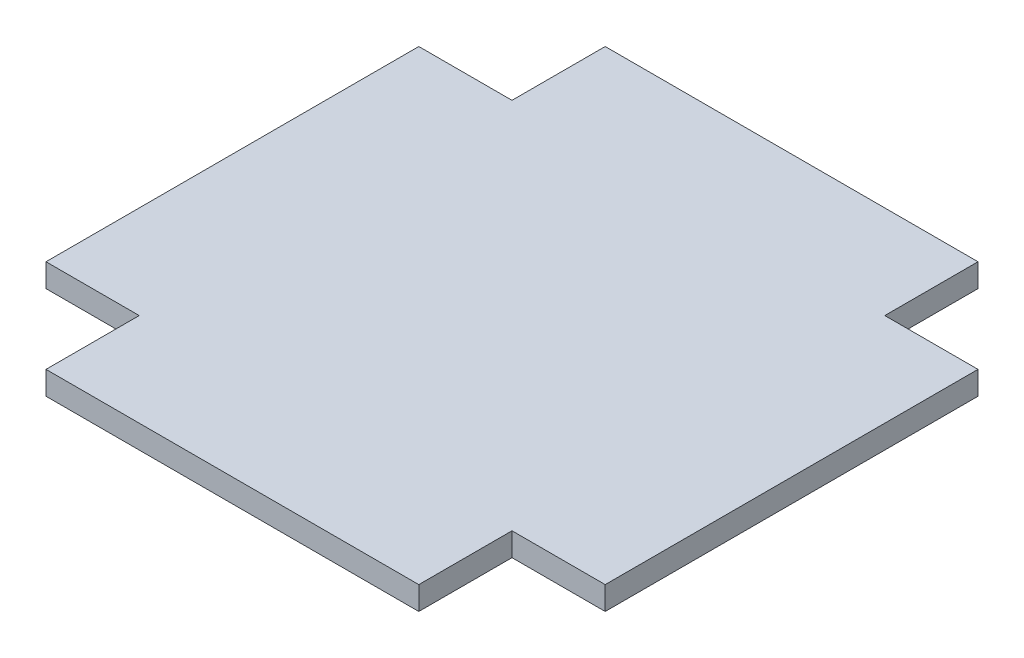
ISO-10303-21;
HEADER;
FILE_DESCRIPTION(('STEP AP214'),'2;1');
FILE_NAME('part.step','',(''),(''),'','','');
FILE_SCHEMA(('AUTOMOTIVE_DESIGN { 1 0 10303 214 1 1 1 1 }'));
ENDSEC;
DATA;
#1=APPLICATION_CONTEXT('core data for automotive mechanical design processes');
#2=APPLICATION_PROTOCOL_DEFINITION('international standard','automotive_design',2000,#1);
#3=PRODUCT_CONTEXT('',#1,'mechanical');
#4=PRODUCT('Part','Part','',(#3));
#5=PRODUCT_RELATED_PRODUCT_CATEGORY('part','',(#4));
#6=PRODUCT_DEFINITION_FORMATION('','',#4);
#7=PRODUCT_DEFINITION_CONTEXT('part definition',#1,'design');
#8=PRODUCT_DEFINITION('design','',#6,#7);
#9=PRODUCT_DEFINITION_SHAPE('','',#8);
#10=(LENGTH_UNIT() NAMED_UNIT(*) SI_UNIT(.MILLI.,.METRE.));
#11=(NAMED_UNIT(*) PLANE_ANGLE_UNIT() SI_UNIT($,.RADIAN.));
#12=(NAMED_UNIT(*) SI_UNIT($,.STERADIAN.) SOLID_ANGLE_UNIT());
#13=UNCERTAINTY_MEASURE_WITH_UNIT(LENGTH_MEASURE(1.E-05),#10,'distance_accuracy_value','');
#14=(GEOMETRIC_REPRESENTATION_CONTEXT(3) GLOBAL_UNCERTAINTY_ASSIGNED_CONTEXT((#13)) GLOBAL_UNIT_ASSIGNED_CONTEXT((#10,
#11,#12)) REPRESENTATION_CONTEXT('',''));
#15=CARTESIAN_POINT('',(0.,0.,0.));
#16=DIRECTION('',(0.,0.,1.));
#17=DIRECTION('',(1.,0.,0.));
#18=AXIS2_PLACEMENT_3D('',#15,#16,#17);
#19=CARTESIAN_POINT('',(-20.,2.5,-30.));
#20=DIRECTION('',(0.,0.,1.));
#21=DIRECTION('',(1.,0.,0.));
#22=AXIS2_PLACEMENT_3D('',#19,#20,#21);
#23=PLANE('',#22);
#24=DIRECTION('',(-1.,0.,0.));
#25=VECTOR('',#24,1.);
#26=CARTESIAN_POINT('',(-20.,0.,-30.));
#27=LINE('',#26,#25);
#28=CARTESIAN_POINT('',(20.,0.,-30.));
#29=VERTEX_POINT('',#28);
#30=CARTESIAN_POINT('',(-20.,0.,-30.));
#31=VERTEX_POINT('',#30);
#32=EDGE_CURVE('E153',#29,#31,#27,.T.);
#33=ORIENTED_EDGE('',*,*,#32,.T.);
#34=DIRECTION('',(0.,-1.,0.));
#35=VECTOR('',#34,1.);
#36=CARTESIAN_POINT('',(-20.,2.5,-30.));
#37=LINE('',#36,#35);
#38=CARTESIAN_POINT('',(-20.,2.5,-30.));
#39=VERTEX_POINT('',#38);
#40=EDGE_CURVE('E11',#39,#31,#37,.T.);
#41=ORIENTED_EDGE('',*,*,#40,.F.);
#42=DIRECTION('',(-1.,0.,0.));
#43=VECTOR('',#42,1.);
#44=CARTESIAN_POINT('',(-20.,2.5,-30.));
#45=LINE('',#44,#43);
#46=CARTESIAN_POINT('',(20.,2.5,-30.));
#47=VERTEX_POINT('',#46);
#48=EDGE_CURVE('E175',#47,#39,#45,.T.);
#49=ORIENTED_EDGE('',*,*,#48,.F.);
#50=DIRECTION('',(0.,-1.,0.));
#51=VECTOR('',#50,1.);
#52=CARTESIAN_POINT('',(20.,2.5,-30.));
#53=LINE('',#52,#51);
#54=EDGE_CURVE('E149',#47,#29,#53,.T.);
#55=ORIENTED_EDGE('',*,*,#54,.T.);
#56=EDGE_LOOP('',(#33,#41,#49,#55));
#57=FACE_BOUND('',#56,.T.);
#58=ADVANCED_FACE('F33',(#57),#23,.F.);
#59=CARTESIAN_POINT('',(-20.,2.5,-30.));
#60=DIRECTION('',(1.,0.,0.));
#61=DIRECTION('',(0.,0.,-1.));
#62=AXIS2_PLACEMENT_3D('',#59,#60,#61);
#63=PLANE('',#62);
#64=DIRECTION('',(0.,0.,1.));
#65=VECTOR('',#64,1.);
#66=CARTESIAN_POINT('',(-20.,0.,-30.));
#67=LINE('',#66,#65);
#68=CARTESIAN_POINT('',(-20.,0.,-20.));
#69=VERTEX_POINT('',#68);
#70=EDGE_CURVE('E156',#31,#69,#67,.T.);
#71=ORIENTED_EDGE('',*,*,#70,.T.);
#72=DIRECTION('',(0.,-1.,0.));
#73=VECTOR('',#72,1.);
#74=CARTESIAN_POINT('',(-20.,2.5,-20.));
#75=LINE('',#74,#73);
#76=CARTESIAN_POINT('',(-20.,2.5,-20.));
#77=VERTEX_POINT('',#76);
#78=EDGE_CURVE('E41',#77,#69,#75,.T.);
#79=ORIENTED_EDGE('',*,*,#78,.F.);
#80=DIRECTION('',(0.,0.,1.));
#81=VECTOR('',#80,1.);
#82=CARTESIAN_POINT('',(-20.,2.5,-30.));
#83=LINE('',#82,#81);
#84=EDGE_CURVE('E104',#39,#77,#83,.T.);
#85=ORIENTED_EDGE('',*,*,#84,.F.);
#86=ORIENTED_EDGE('',*,*,#40,.T.);
#87=EDGE_LOOP('',(#71,#79,#85,#86));
#88=FACE_BOUND('',#87,.T.);
#89=ADVANCED_FACE('F253',(#88),#63,.F.);
#90=CARTESIAN_POINT('',(-20.,2.5,-20.));
#91=DIRECTION('',(0.,0.,1.));
#92=DIRECTION('',(1.,0.,0.));
#93=AXIS2_PLACEMENT_3D('',#90,#91,#92);
#94=PLANE('',#93);
#95=DIRECTION('',(-1.,0.,0.));
#96=VECTOR('',#95,1.);
#97=CARTESIAN_POINT('',(-20.,0.,-20.));
#98=LINE('',#97,#96);
#99=CARTESIAN_POINT('',(-30.,0.,-20.));
#100=VERTEX_POINT('',#99);
#101=EDGE_CURVE('E158',#69,#100,#98,.T.);
#102=ORIENTED_EDGE('',*,*,#101,.T.);
#103=DIRECTION('',(0.,-1.,0.));
#104=VECTOR('',#103,1.);
#105=CARTESIAN_POINT('',(-30.,2.5,-20.));
#106=LINE('',#105,#104);
#107=CARTESIAN_POINT('',(-30.,2.5,-20.));
#108=VERTEX_POINT('',#107);
#109=EDGE_CURVE('E194',#108,#100,#106,.T.);
#110=ORIENTED_EDGE('',*,*,#109,.F.);
#111=DIRECTION('',(-1.,0.,0.));
#112=VECTOR('',#111,1.);
#113=CARTESIAN_POINT('',(-20.,2.5,-20.));
#114=LINE('',#113,#112);
#115=EDGE_CURVE('E202',#77,#108,#114,.T.);
#116=ORIENTED_EDGE('',*,*,#115,.F.);
#117=ORIENTED_EDGE('',*,*,#78,.T.);
#118=EDGE_LOOP('',(#102,#110,#116,#117));
#119=FACE_BOUND('',#118,.T.);
#120=ADVANCED_FACE('F200',(#119),#94,.F.);
#121=CARTESIAN_POINT('',(-30.,2.5,-20.));
#122=DIRECTION('',(1.,0.,0.));
#123=DIRECTION('',(0.,0.,-1.));
#124=AXIS2_PLACEMENT_3D('',#121,#122,#123);
#125=PLANE('',#124);
#126=DIRECTION('',(0.,0.,1.));
#127=VECTOR('',#126,1.);
#128=CARTESIAN_POINT('',(-30.,0.,-20.));
#129=LINE('',#128,#127);
#130=CARTESIAN_POINT('',(-30.,0.,20.));
#131=VERTEX_POINT('',#130);
#132=EDGE_CURVE('E160',#100,#131,#129,.T.);
#133=ORIENTED_EDGE('',*,*,#132,.T.);
#134=DIRECTION('',(0.,-1.,0.));
#135=VECTOR('',#134,1.);
#136=CARTESIAN_POINT('',(-30.,2.5,20.));
#137=LINE('',#136,#135);
#138=CARTESIAN_POINT('',(-30.,2.5,20.));
#139=VERTEX_POINT('',#138);
#140=EDGE_CURVE('E191',#139,#131,#137,.T.);
#141=ORIENTED_EDGE('',*,*,#140,.F.);
#142=DIRECTION('',(0.,0.,1.));
#143=VECTOR('',#142,1.);
#144=CARTESIAN_POINT('',(-30.,2.5,-20.));
#145=LINE('',#144,#143);
#146=EDGE_CURVE('E220',#108,#139,#145,.T.);
#147=ORIENTED_EDGE('',*,*,#146,.F.);
#148=ORIENTED_EDGE('',*,*,#109,.T.);
#149=EDGE_LOOP('',(#133,#141,#147,#148));
#150=FACE_BOUND('',#149,.T.);
#151=ADVANCED_FACE('F211',(#150),#125,.F.);
#152=CARTESIAN_POINT('',(-30.,2.5,20.));
#153=DIRECTION('',(0.,0.,-1.));
#154=DIRECTION('',(-1.,0.,0.));
#155=AXIS2_PLACEMENT_3D('',#152,#153,#154);
#156=PLANE('',#155);
#157=DIRECTION('',(1.,0.,0.));
#158=VECTOR('',#157,1.);
#159=CARTESIAN_POINT('',(-30.,0.,20.));
#160=LINE('',#159,#158);
#161=CARTESIAN_POINT('',(-20.,0.,20.));
#162=VERTEX_POINT('',#161);
#163=EDGE_CURVE('E162',#131,#162,#160,.T.);
#164=ORIENTED_EDGE('',*,*,#163,.T.);
#165=DIRECTION('',(0.,-1.,0.));
#166=VECTOR('',#165,1.);
#167=CARTESIAN_POINT('',(-20.,2.5,20.));
#168=LINE('',#167,#166);
#169=CARTESIAN_POINT('',(-20.,2.5,20.));
#170=VERTEX_POINT('',#169);
#171=EDGE_CURVE('E188',#170,#162,#168,.T.);
#172=ORIENTED_EDGE('',*,*,#171,.F.);
#173=DIRECTION('',(1.,0.,0.));
#174=VECTOR('',#173,1.);
#175=CARTESIAN_POINT('',(-30.,2.5,20.));
#176=LINE('',#175,#174);
#177=EDGE_CURVE('E217',#139,#170,#176,.T.);
#178=ORIENTED_EDGE('',*,*,#177,.F.);
#179=ORIENTED_EDGE('',*,*,#140,.T.);
#180=EDGE_LOOP('',(#164,#172,#178,#179));
#181=FACE_BOUND('',#180,.T.);
#182=ADVANCED_FACE('F215',(#181),#156,.F.);
#183=CARTESIAN_POINT('',(-20.,2.5,20.));
#184=DIRECTION('',(1.,0.,0.));
#185=DIRECTION('',(0.,0.,-1.));
#186=AXIS2_PLACEMENT_3D('',#183,#184,#185);
#187=PLANE('',#186);
#188=DIRECTION('',(0.,0.,1.));
#189=VECTOR('',#188,1.);
#190=CARTESIAN_POINT('',(-20.,0.,20.));
#191=LINE('',#190,#189);
#192=CARTESIAN_POINT('',(-20.,0.,30.));
#193=VERTEX_POINT('',#192);
#194=EDGE_CURVE('E164',#162,#193,#191,.T.);
#195=ORIENTED_EDGE('',*,*,#194,.T.);
#196=DIRECTION('',(0.,-1.,0.));
#197=VECTOR('',#196,1.);
#198=CARTESIAN_POINT('',(-20.,2.5,30.));
#199=LINE('',#198,#197);
#200=CARTESIAN_POINT('',(-20.,2.5,30.));
#201=VERTEX_POINT('',#200);
#202=EDGE_CURVE('E185',#201,#193,#199,.T.);
#203=ORIENTED_EDGE('',*,*,#202,.F.);
#204=DIRECTION('',(0.,0.,1.));
#205=VECTOR('',#204,1.);
#206=CARTESIAN_POINT('',(-20.,2.5,20.));
#207=LINE('',#206,#205);
#208=EDGE_CURVE('E219',#170,#201,#207,.T.);
#209=ORIENTED_EDGE('',*,*,#208,.F.);
#210=ORIENTED_EDGE('',*,*,#171,.T.);
#211=EDGE_LOOP('',(#195,#203,#209,#210));
#212=FACE_BOUND('',#211,.T.);
#213=ADVANCED_FACE('F266',(#212),#187,.F.);
#214=CARTESIAN_POINT('',(-20.,2.5,30.));
#215=DIRECTION('',(0.,0.,-1.));
#216=DIRECTION('',(-1.,0.,0.));
#217=AXIS2_PLACEMENT_3D('',#214,#215,#216);
#218=PLANE('',#217);
#219=DIRECTION('',(1.,0.,0.));
#220=VECTOR('',#219,1.);
#221=CARTESIAN_POINT('',(-20.,0.,30.));
#222=LINE('',#221,#220);
#223=CARTESIAN_POINT('',(20.,0.,30.));
#224=VERTEX_POINT('',#223);
#225=EDGE_CURVE('E166',#193,#224,#222,.T.);
#226=ORIENTED_EDGE('',*,*,#225,.T.);
#227=DIRECTION('',(0.,-1.,0.));
#228=VECTOR('',#227,1.);
#229=CARTESIAN_POINT('',(20.,2.5,30.));
#230=LINE('',#229,#228);
#231=CARTESIAN_POINT('',(20.,2.5,30.));
#232=VERTEX_POINT('',#231);
#233=EDGE_CURVE('E182',#232,#224,#230,.T.);
#234=ORIENTED_EDGE('',*,*,#233,.F.);
#235=DIRECTION('',(1.,0.,0.));
#236=VECTOR('',#235,1.);
#237=CARTESIAN_POINT('',(-20.,2.5,30.));
#238=LINE('',#237,#236);
#239=EDGE_CURVE('E222',#201,#232,#238,.T.);
#240=ORIENTED_EDGE('',*,*,#239,.F.);
#241=ORIENTED_EDGE('',*,*,#202,.T.);
#242=EDGE_LOOP('',(#226,#234,#240,#241));
#243=FACE_BOUND('',#242,.T.);
#244=ADVANCED_FACE('F269',(#243),#218,.F.);
#245=CARTESIAN_POINT('',(20.,2.5,30.));
#246=DIRECTION('',(-1.,0.,0.));
#247=DIRECTION('',(0.,0.,1.));
#248=AXIS2_PLACEMENT_3D('',#245,#246,#247);
#249=PLANE('',#248);
#250=DIRECTION('',(0.,0.,-1.));
#251=VECTOR('',#250,1.);
#252=CARTESIAN_POINT('',(20.,0.,30.));
#253=LINE('',#252,#251);
#254=CARTESIAN_POINT('',(20.,0.,20.));
#255=VERTEX_POINT('',#254);
#256=EDGE_CURVE('E168',#224,#255,#253,.T.);
#257=ORIENTED_EDGE('',*,*,#256,.T.);
#258=DIRECTION('',(0.,-1.,0.));
#259=VECTOR('',#258,1.);
#260=CARTESIAN_POINT('',(20.,2.5,20.));
#261=LINE('',#260,#259);
#262=CARTESIAN_POINT('',(20.,2.5,20.));
#263=VERTEX_POINT('',#262);
#264=EDGE_CURVE('E179',#263,#255,#261,.T.);
#265=ORIENTED_EDGE('',*,*,#264,.F.);
#266=DIRECTION('',(0.,0.,-1.));
#267=VECTOR('',#266,1.);
#268=CARTESIAN_POINT('',(20.,2.5,30.));
#269=LINE('',#268,#267);
#270=EDGE_CURVE('E228',#232,#263,#269,.T.);
#271=ORIENTED_EDGE('',*,*,#270,.F.);
#272=ORIENTED_EDGE('',*,*,#233,.T.);
#273=EDGE_LOOP('',(#257,#265,#271,#272));
#274=FACE_BOUND('',#273,.T.);
#275=ADVANCED_FACE('F234',(#274),#249,.F.);
#276=CARTESIAN_POINT('',(20.,2.5,20.));
#277=DIRECTION('',(0.,0.,-1.));
#278=DIRECTION('',(-1.,0.,0.));
#279=AXIS2_PLACEMENT_3D('',#276,#277,#278);
#280=PLANE('',#279);
#281=DIRECTION('',(1.,0.,0.));
#282=VECTOR('',#281,1.);
#283=CARTESIAN_POINT('',(20.,0.,20.));
#284=LINE('',#283,#282);
#285=CARTESIAN_POINT('',(30.,0.,20.));
#286=VERTEX_POINT('',#285);
#287=EDGE_CURVE('E170',#255,#286,#284,.T.);
#288=ORIENTED_EDGE('',*,*,#287,.T.);
#289=DIRECTION('',(0.,-1.,0.));
#290=VECTOR('',#289,1.);
#291=CARTESIAN_POINT('',(30.,2.5,20.));
#292=LINE('',#291,#290);
#293=CARTESIAN_POINT('',(30.,2.5,20.));
#294=VERTEX_POINT('',#293);
#295=EDGE_CURVE('E144',#294,#286,#292,.T.);
#296=ORIENTED_EDGE('',*,*,#295,.F.);
#297=DIRECTION('',(1.,0.,0.));
#298=VECTOR('',#297,1.);
#299=CARTESIAN_POINT('',(20.,2.5,20.));
#300=LINE('',#299,#298);
#301=EDGE_CURVE('E135',#263,#294,#300,.T.);
#302=ORIENTED_EDGE('',*,*,#301,.F.);
#303=ORIENTED_EDGE('',*,*,#264,.T.);
#304=EDGE_LOOP('',(#288,#296,#302,#303));
#305=FACE_BOUND('',#304,.T.);
#306=ADVANCED_FACE('F238',(#305),#280,.F.);
#307=CARTESIAN_POINT('',(30.,2.5,-20.));
#308=DIRECTION('',(-1.,0.,0.));
#309=DIRECTION('',(0.,0.,1.));
#310=AXIS2_PLACEMENT_3D('',#307,#308,#309);
#311=PLANE('',#310);
#312=DIRECTION('',(0.,0.,-1.));
#313=VECTOR('',#312,1.);
#314=CARTESIAN_POINT('',(30.,0.,-20.));
#315=LINE('',#314,#313);
#316=CARTESIAN_POINT('',(30.,0.,-20.));
#317=VERTEX_POINT('',#316);
#318=EDGE_CURVE('E143',#286,#317,#315,.T.);
#319=ORIENTED_EDGE('',*,*,#318,.T.);
#320=DIRECTION('',(0.,-1.,0.));
#321=VECTOR('',#320,1.);
#322=CARTESIAN_POINT('',(30.,2.5,-20.));
#323=LINE('',#322,#321);
#324=CARTESIAN_POINT('',(30.,2.5,-20.));
#325=VERTEX_POINT('',#324);
#326=EDGE_CURVE('E140',#325,#317,#323,.T.);
#327=ORIENTED_EDGE('',*,*,#326,.F.);
#328=DIRECTION('',(0.,0.,-1.));
#329=VECTOR('',#328,1.);
#330=CARTESIAN_POINT('',(30.,2.5,-20.));
#331=LINE('',#330,#329);
#332=EDGE_CURVE('E129',#294,#325,#331,.T.);
#333=ORIENTED_EDGE('',*,*,#332,.F.);
#334=ORIENTED_EDGE('',*,*,#295,.T.);
#335=EDGE_LOOP('',(#319,#327,#333,#334));
#336=FACE_BOUND('',#335,.T.);
#337=ADVANCED_FACE('F141',(#336),#311,.F.);
#338=CARTESIAN_POINT('',(20.,2.5,-20.));
#339=DIRECTION('',(0.,0.,1.));
#340=DIRECTION('',(1.,0.,0.));
#341=AXIS2_PLACEMENT_3D('',#338,#339,#340);
#342=PLANE('',#341);
#343=DIRECTION('',(-1.,0.,0.));
#344=VECTOR('',#343,1.);
#345=CARTESIAN_POINT('',(20.,0.,-20.));
#346=LINE('',#345,#344);
#347=CARTESIAN_POINT('',(20.,0.,-20.));
#348=VERTEX_POINT('',#347);
#349=EDGE_CURVE('E90',#317,#348,#346,.T.);
#350=ORIENTED_EDGE('',*,*,#349,.T.);
#351=DIRECTION('',(0.,-1.,0.));
#352=VECTOR('',#351,1.);
#353=CARTESIAN_POINT('',(20.,2.5,-20.));
#354=LINE('',#353,#352);
#355=CARTESIAN_POINT('',(20.,2.5,-20.));
#356=VERTEX_POINT('',#355);
#357=EDGE_CURVE('E145',#356,#348,#354,.T.);
#358=ORIENTED_EDGE('',*,*,#357,.F.);
#359=DIRECTION('',(-1.,0.,0.));
#360=VECTOR('',#359,1.);
#361=CARTESIAN_POINT('',(20.,2.5,-20.));
#362=LINE('',#361,#360);
#363=EDGE_CURVE('E133',#325,#356,#362,.T.);
#364=ORIENTED_EDGE('',*,*,#363,.F.);
#365=ORIENTED_EDGE('',*,*,#326,.T.);
#366=EDGE_LOOP('',(#350,#358,#364,#365));
#367=FACE_BOUND('',#366,.T.);
#368=ADVANCED_FACE('F147',(#367),#342,.F.);
#369=CARTESIAN_POINT('',(20.,2.5,-30.));
#370=DIRECTION('',(-1.,0.,0.));
#371=DIRECTION('',(0.,0.,1.));
#372=AXIS2_PLACEMENT_3D('',#369,#370,#371);
#373=PLANE('',#372);
#374=DIRECTION('',(0.,0.,-1.));
#375=VECTOR('',#374,1.);
#376=CARTESIAN_POINT('',(20.,0.,-30.));
#377=LINE('',#376,#375);
#378=EDGE_CURVE('E96',#348,#29,#377,.T.);
#379=ORIENTED_EDGE('',*,*,#378,.T.);
#380=ORIENTED_EDGE('',*,*,#54,.F.);
#381=DIRECTION('',(0.,0.,-1.));
#382=VECTOR('',#381,1.);
#383=CARTESIAN_POINT('',(20.,2.5,-30.));
#384=LINE('',#383,#382);
#385=EDGE_CURVE('E49',#356,#47,#384,.T.);
#386=ORIENTED_EDGE('',*,*,#385,.F.);
#387=ORIENTED_EDGE('',*,*,#357,.T.);
#388=EDGE_LOOP('',(#379,#380,#386,#387));
#389=FACE_BOUND('',#388,.T.);
#390=ADVANCED_FACE('F242',(#389),#373,.F.);
#391=CARTESIAN_POINT('',(0.,2.5,0.));
#392=DIRECTION('',(0.,-1.,0.));
#393=DIRECTION('',(0.,0.,-1.));
#394=AXIS2_PLACEMENT_3D('',#391,#392,#393);
#395=PLANE('',#394);
#396=ORIENTED_EDGE('',*,*,#48,.T.);
#397=ORIENTED_EDGE('',*,*,#84,.T.);
#398=ORIENTED_EDGE('',*,*,#115,.T.);
#399=ORIENTED_EDGE('',*,*,#146,.T.);
#400=ORIENTED_EDGE('',*,*,#177,.T.);
#401=ORIENTED_EDGE('',*,*,#208,.T.);
#402=ORIENTED_EDGE('',*,*,#239,.T.);
#403=ORIENTED_EDGE('',*,*,#270,.T.);
#404=ORIENTED_EDGE('',*,*,#301,.T.);
#405=ORIENTED_EDGE('',*,*,#332,.T.);
#406=ORIENTED_EDGE('',*,*,#363,.T.);
#407=ORIENTED_EDGE('',*,*,#385,.T.);
#408=EDGE_LOOP('',(#396,#397,#398,#399,#400,#401,#402,#403,#404,#405,#406,#407));
#409=FACE_BOUND('',#408,.T.);
#410=ADVANCED_FACE('F131',(#409),#395,.F.);
#411=CARTESIAN_POINT('',(0.,0.,0.));
#412=DIRECTION('',(0.,-1.,0.));
#413=DIRECTION('',(0.,0.,-1.));
#414=AXIS2_PLACEMENT_3D('',#411,#412,#413);
#415=PLANE('',#414);
#416=ORIENTED_EDGE('',*,*,#32,.F.);
#417=ORIENTED_EDGE('',*,*,#378,.F.);
#418=ORIENTED_EDGE('',*,*,#349,.F.);
#419=ORIENTED_EDGE('',*,*,#318,.F.);
#420=ORIENTED_EDGE('',*,*,#287,.F.);
#421=ORIENTED_EDGE('',*,*,#256,.F.);
#422=ORIENTED_EDGE('',*,*,#225,.F.);
#423=ORIENTED_EDGE('',*,*,#194,.F.);
#424=ORIENTED_EDGE('',*,*,#163,.F.);
#425=ORIENTED_EDGE('',*,*,#132,.F.);
#426=ORIENTED_EDGE('',*,*,#101,.F.);
#427=ORIENTED_EDGE('',*,*,#70,.F.);
#428=EDGE_LOOP('',(#416,#417,#418,#419,#420,#421,#422,#423,#424,#425,#426,#427));
#429=FACE_BOUND('',#428,.T.);
#430=ADVANCED_FACE('F206',(#429),#415,.T.);
#431=CLOSED_SHELL('',(#58,#89,#120,#151,#182,#213,#244,#275,#306,#337,#368,#390,#410,#430));
#432=MANIFOLD_SOLID_BREP('B2',#431);
#433=ADVANCED_BREP_SHAPE_REPRESENTATION('',(#18,#432),#14);
#434=SHAPE_DEFINITION_REPRESENTATION(#9,#433);
ENDSEC;
END-ISO-10303-21;
